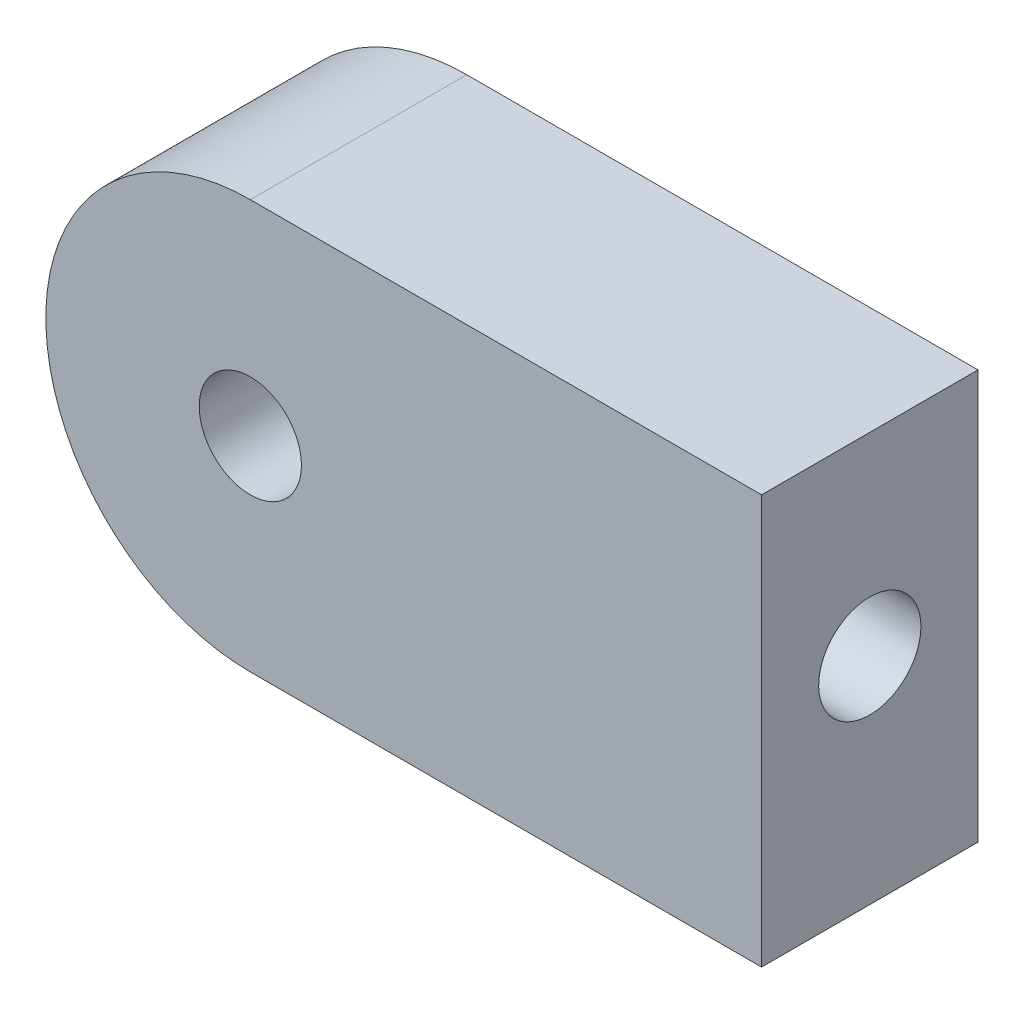
ISO-10303-21;
HEADER;
FILE_DESCRIPTION(('STEP AP214'),'2;1');
FILE_NAME('part.step','',(''),(''),'','','');
FILE_SCHEMA(('AUTOMOTIVE_DESIGN { 1 0 10303 214 1 1 1 1 }'));
ENDSEC;
DATA;
#1=APPLICATION_CONTEXT('core data for automotive mechanical design processes');
#2=APPLICATION_PROTOCOL_DEFINITION('international standard','automotive_design',2000,#1);
#3=PRODUCT_CONTEXT('',#1,'mechanical');
#4=PRODUCT('Part','Part','',(#3));
#5=PRODUCT_RELATED_PRODUCT_CATEGORY('part','',(#4));
#6=PRODUCT_DEFINITION_FORMATION('','',#4);
#7=PRODUCT_DEFINITION_CONTEXT('part definition',#1,'design');
#8=PRODUCT_DEFINITION('design','',#6,#7);
#9=PRODUCT_DEFINITION_SHAPE('','',#8);
#10=(LENGTH_UNIT() NAMED_UNIT(*) SI_UNIT(.MILLI.,.METRE.));
#11=(NAMED_UNIT(*) PLANE_ANGLE_UNIT() SI_UNIT($,.RADIAN.));
#12=(NAMED_UNIT(*) SI_UNIT($,.STERADIAN.) SOLID_ANGLE_UNIT());
#13=UNCERTAINTY_MEASURE_WITH_UNIT(LENGTH_MEASURE(1.E-05),#10,'distance_accuracy_value','');
#14=(GEOMETRIC_REPRESENTATION_CONTEXT(3) GLOBAL_UNCERTAINTY_ASSIGNED_CONTEXT((#13)) GLOBAL_UNIT_ASSIGNED_CONTEXT((#10,
#11,#12)) REPRESENTATION_CONTEXT('',''));
#15=CARTESIAN_POINT('',(0.,0.,0.));
#16=DIRECTION('',(0.,0.,1.));
#17=DIRECTION('',(1.,0.,0.));
#18=AXIS2_PLACEMENT_3D('',#15,#16,#17);
#19=CARTESIAN_POINT('',(0.,0.,6.35));
#20=DIRECTION('',(0.,0.,-1.));
#21=DIRECTION('',(-1.,0.,0.));
#22=AXIS2_PLACEMENT_3D('',#19,#20,#21);
#23=CYLINDRICAL_SURFACE('',#22,6.);
#24=CARTESIAN_POINT('',(0.,0.,0.));
#25=DIRECTION('',(0.,0.,1.));
#26=DIRECTION('',(-1.,0.,0.));
#27=AXIS2_PLACEMENT_3D('',#24,#25,#26);
#28=CIRCLE('',#27,6.);
#29=CARTESIAN_POINT('',(0.,6.,0.));
#30=VERTEX_POINT('',#29);
#31=CARTESIAN_POINT('',(0.,-6.,0.));
#32=VERTEX_POINT('',#31);
#33=EDGE_CURVE('E107',#30,#32,#28,.T.);
#34=ORIENTED_EDGE('',*,*,#33,.T.);
#35=DIRECTION('',(0.,0.,-1.));
#36=VECTOR('',#35,1.);
#37=CARTESIAN_POINT('',(0.,-6.,6.35));
#38=LINE('',#37,#36);
#39=CARTESIAN_POINT('',(0.,-6.,6.35));
#40=VERTEX_POINT('',#39);
#41=EDGE_CURVE('E11',#40,#32,#38,.T.);
#42=ORIENTED_EDGE('',*,*,#41,.F.);
#43=CARTESIAN_POINT('',(0.,0.,6.35));
#44=DIRECTION('',(0.,0.,1.));
#45=DIRECTION('',(-1.,0.,0.));
#46=AXIS2_PLACEMENT_3D('',#43,#44,#45);
#47=CIRCLE('',#46,6.);
#48=CARTESIAN_POINT('',(0.,6.,6.35));
#49=VERTEX_POINT('',#48);
#50=EDGE_CURVE('E91',#49,#40,#47,.T.);
#51=ORIENTED_EDGE('',*,*,#50,.F.);
#52=DIRECTION('',(0.,0.,-1.));
#53=VECTOR('',#52,1.);
#54=CARTESIAN_POINT('',(0.,6.,6.35));
#55=LINE('',#54,#53);
#56=EDGE_CURVE('E103',#49,#30,#55,.T.);
#57=ORIENTED_EDGE('',*,*,#56,.T.);
#58=EDGE_LOOP('',(#34,#42,#51,#57));
#59=FACE_BOUND('',#58,.T.);
#60=ADVANCED_FACE('F39',(#59),#23,.T.);
#61=CARTESIAN_POINT('',(15.,-6.,6.35));
#62=DIRECTION('',(0.,1.,0.));
#63=DIRECTION('',(-1.,0.,0.));
#64=AXIS2_PLACEMENT_3D('',#61,#62,#63);
#65=PLANE('',#64);
#66=DIRECTION('',(1.,0.,0.));
#67=VECTOR('',#66,1.);
#68=CARTESIAN_POINT('',(15.,-6.,0.));
#69=LINE('',#68,#67);
#70=CARTESIAN_POINT('',(15.,-6.,0.));
#71=VERTEX_POINT('',#70);
#72=EDGE_CURVE('E96',#32,#71,#69,.T.);
#73=ORIENTED_EDGE('',*,*,#72,.T.);
#74=DIRECTION('',(0.,0.,-1.));
#75=VECTOR('',#74,1.);
#76=CARTESIAN_POINT('',(15.,-6.,6.35));
#77=LINE('',#76,#75);
#78=CARTESIAN_POINT('',(15.,-6.,6.35));
#79=VERTEX_POINT('',#78);
#80=EDGE_CURVE('E48',#79,#71,#77,.T.);
#81=ORIENTED_EDGE('',*,*,#80,.F.);
#82=DIRECTION('',(1.,0.,0.));
#83=VECTOR('',#82,1.);
#84=CARTESIAN_POINT('',(15.,-6.,6.35));
#85=LINE('',#84,#83);
#86=EDGE_CURVE('E86',#40,#79,#85,.T.);
#87=ORIENTED_EDGE('',*,*,#86,.F.);
#88=ORIENTED_EDGE('',*,*,#41,.T.);
#89=EDGE_LOOP('',(#73,#81,#87,#88));
#90=FACE_BOUND('',#89,.T.);
#91=ADVANCED_FACE('F95',(#90),#65,.F.);
#92=CARTESIAN_POINT('',(15.,6.,6.35));
#93=DIRECTION('',(-1.,0.,0.));
#94=DIRECTION('',(0.,-1.,0.));
#95=AXIS2_PLACEMENT_3D('',#92,#93,#94);
#96=PLANE('',#95);
#97=CARTESIAN_POINT('',(15.,0.318926735076277,3.175));
#98=DIRECTION('',(1.,0.,0.));
#99=DIRECTION('',(0.,1.,0.));
#100=AXIS2_PLACEMENT_3D('',#97,#98,#99);
#101=CIRCLE('',#100,1.5);
#102=CARTESIAN_POINT('',(15.,1.81892673507628,3.175));
#103=VERTEX_POINT('',#102);
#104=EDGE_CURVE('E128',#103,#103,#101,.T.);
#105=ORIENTED_EDGE('',*,*,#104,.F.);
#106=EDGE_LOOP('',(#105));
#107=FACE_BOUND('',#106,.T.);
#108=DIRECTION('',(0.,1.,0.));
#109=VECTOR('',#108,1.);
#110=CARTESIAN_POINT('',(15.,6.,0.));
#111=LINE('',#110,#109);
#112=CARTESIAN_POINT('',(15.,6.,0.));
#113=VERTEX_POINT('',#112);
#114=EDGE_CURVE('E73',#71,#113,#111,.T.);
#115=ORIENTED_EDGE('',*,*,#114,.T.);
#116=DIRECTION('',(0.,0.,-1.));
#117=VECTOR('',#116,1.);
#118=CARTESIAN_POINT('',(15.,6.,6.35));
#119=LINE('',#118,#117);
#120=CARTESIAN_POINT('',(15.,6.,6.35));
#121=VERTEX_POINT('',#120);
#122=EDGE_CURVE('E98',#121,#113,#119,.T.);
#123=ORIENTED_EDGE('',*,*,#122,.F.);
#124=DIRECTION('',(0.,1.,0.));
#125=VECTOR('',#124,1.);
#126=CARTESIAN_POINT('',(15.,6.,6.35));
#127=LINE('',#126,#125);
#128=EDGE_CURVE('E89',#79,#121,#127,.T.);
#129=ORIENTED_EDGE('',*,*,#128,.F.);
#130=ORIENTED_EDGE('',*,*,#80,.T.);
#131=EDGE_LOOP('',(#115,#123,#129,#130));
#132=FACE_BOUND('',#131,.T.);
#133=ADVANCED_FACE('F99',(#107,#132),#96,.F.);
#134=CARTESIAN_POINT('',(0.,6.,6.35));
#135=DIRECTION('',(0.,-1.,0.));
#136=DIRECTION('',(0.,0.,-1.));
#137=AXIS2_PLACEMENT_3D('',#134,#135,#136);
#138=PLANE('',#137);
#139=DIRECTION('',(-1.,0.,0.));
#140=VECTOR('',#139,1.);
#141=CARTESIAN_POINT('',(0.,6.,0.));
#142=LINE('',#141,#140);
#143=EDGE_CURVE('E79',#113,#30,#142,.T.);
#144=ORIENTED_EDGE('',*,*,#143,.T.);
#145=ORIENTED_EDGE('',*,*,#56,.F.);
#146=DIRECTION('',(-1.,0.,0.));
#147=VECTOR('',#146,1.);
#148=CARTESIAN_POINT('',(0.,6.,6.35));
#149=LINE('',#148,#147);
#150=EDGE_CURVE('E56',#121,#49,#149,.T.);
#151=ORIENTED_EDGE('',*,*,#150,.F.);
#152=ORIENTED_EDGE('',*,*,#122,.T.);
#153=EDGE_LOOP('',(#144,#145,#151,#152));
#154=FACE_BOUND('',#153,.T.);
#155=ADVANCED_FACE('F121',(#154),#138,.F.);
#156=CARTESIAN_POINT('',(0.,0.,6.35));
#157=DIRECTION('',(0.,0.,-1.));
#158=DIRECTION('',(-1.,0.,0.));
#159=AXIS2_PLACEMENT_3D('',#156,#157,#158);
#160=PLANE('',#159);
#161=CARTESIAN_POINT('',(0.,0.,6.35));
#162=DIRECTION('',(0.,0.,1.));
#163=DIRECTION('',(1.,0.,0.));
#164=AXIS2_PLACEMENT_3D('',#161,#162,#163);
#165=CIRCLE('',#164,1.5);
#166=CARTESIAN_POINT('',(1.5,0.,6.35));
#167=VERTEX_POINT('',#166);
#168=EDGE_CURVE('E136',#167,#167,#165,.T.);
#169=ORIENTED_EDGE('',*,*,#168,.F.);
#170=EDGE_LOOP('',(#169));
#171=FACE_BOUND('',#170,.T.);
#172=ORIENTED_EDGE('',*,*,#50,.T.);
#173=ORIENTED_EDGE('',*,*,#86,.T.);
#174=ORIENTED_EDGE('',*,*,#128,.T.);
#175=ORIENTED_EDGE('',*,*,#150,.T.);
#176=EDGE_LOOP('',(#172,#173,#174,#175));
#177=FACE_BOUND('',#176,.T.);
#178=ADVANCED_FACE('F87',(#171,#177),#160,.F.);
#179=CARTESIAN_POINT('',(0.,0.,0.));
#180=DIRECTION('',(0.,0.,-1.));
#181=DIRECTION('',(-1.,0.,0.));
#182=AXIS2_PLACEMENT_3D('',#179,#180,#181);
#183=PLANE('',#182);
#184=CARTESIAN_POINT('',(0.,0.,0.));
#185=DIRECTION('',(0.,0.,1.));
#186=DIRECTION('',(1.,0.,0.));
#187=AXIS2_PLACEMENT_3D('',#184,#185,#186);
#188=CIRCLE('',#187,1.5);
#189=CARTESIAN_POINT('',(1.5,0.,0.));
#190=VERTEX_POINT('',#189);
#191=EDGE_CURVE('E132',#190,#190,#188,.T.);
#192=ORIENTED_EDGE('',*,*,#191,.T.);
#193=EDGE_LOOP('',(#192));
#194=FACE_BOUND('',#193,.T.);
#195=ORIENTED_EDGE('',*,*,#33,.F.);
#196=ORIENTED_EDGE('',*,*,#143,.F.);
#197=ORIENTED_EDGE('',*,*,#114,.F.);
#198=ORIENTED_EDGE('',*,*,#72,.F.);
#199=EDGE_LOOP('',(#195,#196,#197,#198));
#200=FACE_BOUND('',#199,.T.);
#201=ADVANCED_FACE('F124',(#194,#200),#183,.T.);
#202=CARTESIAN_POINT('',(8.65,0.318926735076276,3.175));
#203=DIRECTION('',(1.,0.,0.));
#204=DIRECTION('',(0.,1.,0.));
#205=AXIS2_PLACEMENT_3D('',#202,#203,#204);
#206=CYLINDRICAL_SURFACE('',#205,1.5);
#207=CARTESIAN_POINT('',(8.65,0.318926735076276,3.175));
#208=DIRECTION('',(1.,0.,0.));
#209=DIRECTION('',(0.,1.,0.));
#210=AXIS2_PLACEMENT_3D('',#207,#208,#209);
#211=CIRCLE('',#210,1.5);
#212=CARTESIAN_POINT('',(8.65,1.81892673507628,3.175));
#213=VERTEX_POINT('',#212);
#214=EDGE_CURVE('E111',#213,#213,#211,.T.);
#215=ORIENTED_EDGE('',*,*,#214,.F.);
#216=EDGE_LOOP('',(#215));
#217=FACE_BOUND('',#216,.T.);
#218=ORIENTED_EDGE('',*,*,#104,.T.);
#219=EDGE_LOOP('',(#218));
#220=FACE_BOUND('',#219,.T.);
#221=ADVANCED_FACE('F158',(#217,#220),#206,.F.);
#222=CARTESIAN_POINT('',(8.65,0.318926735076276,3.175));
#223=DIRECTION('',(1.,0.,0.));
#224=DIRECTION('',(0.,1.,0.));
#225=AXIS2_PLACEMENT_3D('',#222,#223,#224);
#226=PLANE('',#225);
#227=ORIENTED_EDGE('',*,*,#214,.T.);
#228=EDGE_LOOP('',(#227));
#229=FACE_BOUND('',#228,.T.);
#230=ADVANCED_FACE('F148',(#229),#226,.T.);
#231=CARTESIAN_POINT('',(0.,0.,0.));
#232=DIRECTION('',(0.,0.,1.));
#233=DIRECTION('',(1.,0.,0.));
#234=AXIS2_PLACEMENT_3D('',#231,#232,#233);
#235=CYLINDRICAL_SURFACE('',#234,1.5);
#236=ORIENTED_EDGE('',*,*,#191,.F.);
#237=EDGE_LOOP('',(#236));
#238=FACE_BOUND('',#237,.T.);
#239=ORIENTED_EDGE('',*,*,#168,.T.);
#240=EDGE_LOOP('',(#239));
#241=FACE_BOUND('',#240,.T.);
#242=ADVANCED_FACE('F145',(#238,#241),#235,.F.);
#243=CLOSED_SHELL('',(#60,#91,#133,#155,#178,#201,#221,#230,#242));
#244=MANIFOLD_SOLID_BREP('B2',#243);
#245=ADVANCED_BREP_SHAPE_REPRESENTATION('',(#18,#244),#14);
#246=SHAPE_DEFINITION_REPRESENTATION(#9,#245);
ENDSEC;
END-ISO-10303-21;
